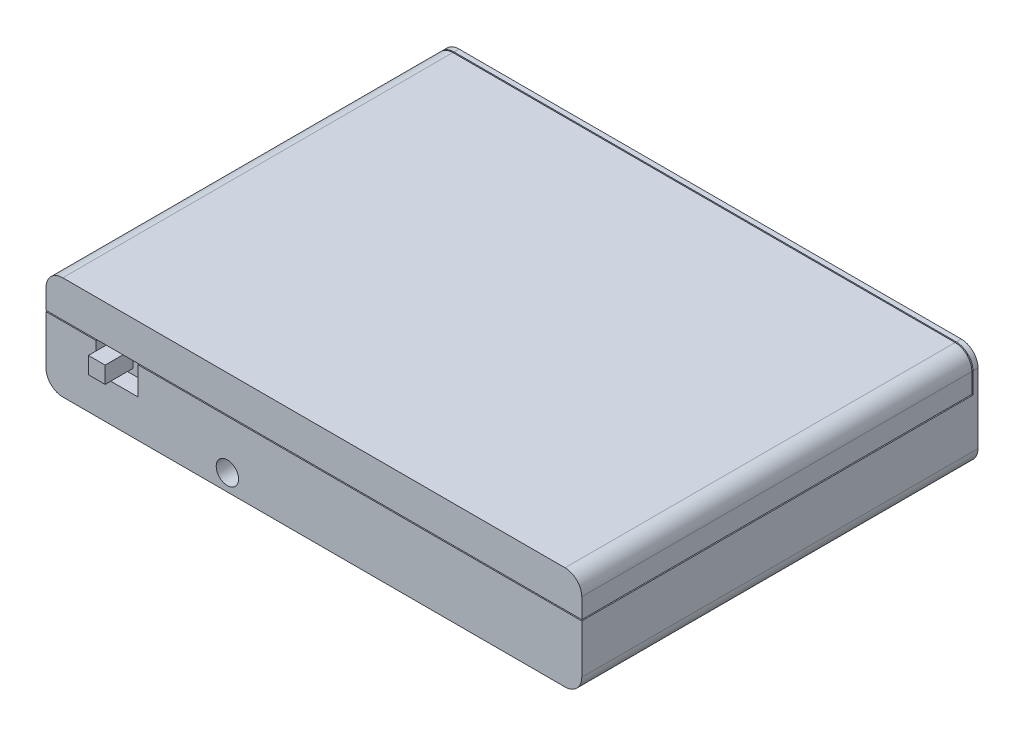
ISO-10303-21;
HEADER;
FILE_DESCRIPTION(('STEP AP214'),'2;1');
FILE_NAME('part.step','',(''),(''),'','','');
FILE_SCHEMA(('AUTOMOTIVE_DESIGN { 1 0 10303 214 1 1 1 1 }'));
ENDSEC;
DATA;
#1=APPLICATION_CONTEXT('core data for automotive mechanical design processes');
#2=APPLICATION_PROTOCOL_DEFINITION('international standard','automotive_design',2000,#1);
#3=PRODUCT_CONTEXT('',#1,'mechanical');
#4=PRODUCT('Part','Part','',(#3));
#5=PRODUCT_RELATED_PRODUCT_CATEGORY('part','',(#4));
#6=PRODUCT_DEFINITION_FORMATION('','',#4);
#7=PRODUCT_DEFINITION_CONTEXT('part definition',#1,'design');
#8=PRODUCT_DEFINITION('design','',#6,#7);
#9=PRODUCT_DEFINITION_SHAPE('','',#8);
#10=(LENGTH_UNIT() NAMED_UNIT(*) SI_UNIT(.MILLI.,.METRE.));
#11=(NAMED_UNIT(*) PLANE_ANGLE_UNIT() SI_UNIT($,.RADIAN.));
#12=(NAMED_UNIT(*) SI_UNIT($,.STERADIAN.) SOLID_ANGLE_UNIT());
#13=UNCERTAINTY_MEASURE_WITH_UNIT(LENGTH_MEASURE(1.E-05),#10,'distance_accuracy_value','');
#14=(GEOMETRIC_REPRESENTATION_CONTEXT(3) GLOBAL_UNCERTAINTY_ASSIGNED_CONTEXT((#13)) GLOBAL_UNIT_ASSIGNED_CONTEXT((#10,
#11,#12)) REPRESENTATION_CONTEXT('',''));
#15=CARTESIAN_POINT('',(0.,0.,0.));
#16=DIRECTION('',(0.,0.,1.));
#17=DIRECTION('',(1.,0.,0.));
#18=AXIS2_PLACEMENT_3D('',#15,#16,#17);
#19=CARTESIAN_POINT('',(48.,-9.25,-35.5));
#20=DIRECTION('',(1.,0.,0.));
#21=DIRECTION('',(0.,0.,-1.));
#22=AXIS2_PLACEMENT_3D('',#19,#20,#21);
#23=PLANE('',#22);
#24=DIRECTION('',(0.,1.,0.));
#25=VECTOR('',#24,1.);
#26=CARTESIAN_POINT('',(48.,8.25,-34.4));
#27=LINE('',#26,#25);
#28=CARTESIAN_POINT('',(48.,2.7,-34.4));
#29=VERTEX_POINT('',#28);
#30=CARTESIAN_POINT('',(48.,6.25,-34.4));
#31=VERTEX_POINT('',#30);
#32=EDGE_CURVE('E301',#29,#31,#27,.T.);
#33=ORIENTED_EDGE('',*,*,#32,.T.);
#34=DIRECTION('',(0.,0.,-1.));
#35=VECTOR('',#34,1.);
#36=CARTESIAN_POINT('',(48.,6.25,-35.5));
#37=LINE('',#36,#35);
#38=CARTESIAN_POINT('',(48.,6.25,35.5));
#39=VERTEX_POINT('',#38);
#40=EDGE_CURVE('E11',#31,#39,#37,.F.);
#41=ORIENTED_EDGE('',*,*,#40,.T.);
#42=DIRECTION('',(0.,1.,0.));
#43=VECTOR('',#42,1.);
#44=CARTESIAN_POINT('',(48.,-9.25,35.5));
#45=LINE('',#44,#43);
#46=CARTESIAN_POINT('',(48.,2.7,35.5));
#47=VERTEX_POINT('',#46);
#48=EDGE_CURVE('E413',#47,#39,#45,.T.);
#49=ORIENTED_EDGE('',*,*,#48,.F.);
#50=DIRECTION('',(0.,0.,1.));
#51=VECTOR('',#50,1.);
#52=CARTESIAN_POINT('',(48.,2.7,34.5));
#53=LINE('',#52,#51);
#54=EDGE_CURVE('E325',#29,#47,#53,.T.);
#55=ORIENTED_EDGE('',*,*,#54,.F.);
#56=EDGE_LOOP('',(#33,#41,#49,#55));
#57=FACE_BOUND('',#56,.T.);
#58=ADVANCED_FACE('F33',(#57),#23,.T.);
#59=CARTESIAN_POINT('',(0.,8.25,0.));
#60=DIRECTION('',(0.,1.,0.));
#61=DIRECTION('',(0.,0.,1.));
#62=AXIS2_PLACEMENT_3D('',#59,#60,#61);
#63=PLANE('',#62);
#64=DIRECTION('',(1.,0.,0.));
#65=VECTOR('',#64,1.);
#66=CARTESIAN_POINT('',(48.,8.25,-34.4));
#67=LINE('',#66,#65);
#68=CARTESIAN_POINT('',(-47.,8.25,-34.4));
#69=VERTEX_POINT('',#68);
#70=CARTESIAN_POINT('',(47.,8.25,-34.4));
#71=VERTEX_POINT('',#70);
#72=EDGE_CURVE('E289',#69,#71,#67,.T.);
#73=ORIENTED_EDGE('',*,*,#72,.T.);
#74=DIRECTION('',(0.,0.,1.));
#75=VECTOR('',#74,1.);
#76=CARTESIAN_POINT('',(47.,8.25,-34.4));
#77=LINE('',#76,#75);
#78=CARTESIAN_POINT('',(47.,8.25,-34.6));
#79=VERTEX_POINT('',#78);
#80=EDGE_CURVE('E260',#79,#71,#77,.T.);
#81=ORIENTED_EDGE('',*,*,#80,.F.);
#82=DIRECTION('',(-1.,0.,0.));
#83=VECTOR('',#82,1.);
#84=CARTESIAN_POINT('',(48.,8.25,-34.6));
#85=LINE('',#84,#83);
#86=CARTESIAN_POINT('',(-47.,8.25,-34.6));
#87=VERTEX_POINT('',#86);
#88=EDGE_CURVE('E266',#79,#87,#85,.T.);
#89=ORIENTED_EDGE('',*,*,#88,.T.);
#90=DIRECTION('',(0.,0.,-1.));
#91=VECTOR('',#90,1.);
#92=CARTESIAN_POINT('',(-47.,8.25,-34.4));
#93=LINE('',#92,#91);
#94=EDGE_CURVE('E276',#69,#87,#93,.T.);
#95=ORIENTED_EDGE('',*,*,#94,.F.);
#96=EDGE_LOOP('',(#73,#81,#89,#95));
#97=FACE_BOUND('',#96,.T.);
#98=ADVANCED_FACE('F508',(#97),#63,.T.);
#99=CARTESIAN_POINT('',(-48.,-9.25,-35.5));
#100=DIRECTION('',(-1.,0.,0.));
#101=DIRECTION('',(0.,0.,1.));
#102=AXIS2_PLACEMENT_3D('',#99,#100,#101);
#103=PLANE('',#102);
#104=DIRECTION('',(0.,1.,0.));
#105=VECTOR('',#104,1.);
#106=CARTESIAN_POINT('',(-48.,-9.25,35.5));
#107=LINE('',#106,#105);
#108=CARTESIAN_POINT('',(-48.,2.7,35.5));
#109=VERTEX_POINT('',#108);
#110=CARTESIAN_POINT('',(-48.,6.25,35.5));
#111=VERTEX_POINT('',#110);
#112=EDGE_CURVE('E416',#109,#111,#107,.T.);
#113=ORIENTED_EDGE('',*,*,#112,.T.);
#114=DIRECTION('',(0.,0.,1.));
#115=VECTOR('',#114,1.);
#116=CARTESIAN_POINT('',(-48.,6.25,-35.5));
#117=LINE('',#116,#115);
#118=CARTESIAN_POINT('',(-48.,6.25,-34.4));
#119=VERTEX_POINT('',#118);
#120=EDGE_CURVE('E56',#111,#119,#117,.F.);
#121=ORIENTED_EDGE('',*,*,#120,.T.);
#122=DIRECTION('',(0.,1.,0.));
#123=VECTOR('',#122,1.);
#124=CARTESIAN_POINT('',(-48.,8.25,-34.4));
#125=LINE('',#124,#123);
#126=CARTESIAN_POINT('',(-48.,2.7,-34.4));
#127=VERTEX_POINT('',#126);
#128=EDGE_CURVE('E294',#127,#119,#125,.T.);
#129=ORIENTED_EDGE('',*,*,#128,.F.);
#130=DIRECTION('',(0.,0.,1.));
#131=VECTOR('',#130,1.);
#132=CARTESIAN_POINT('',(-48.,2.7,34.5));
#133=LINE('',#132,#131);
#134=EDGE_CURVE('E322',#127,#109,#133,.T.);
#135=ORIENTED_EDGE('',*,*,#134,.T.);
#136=EDGE_LOOP('',(#113,#121,#129,#135));
#137=FACE_BOUND('',#136,.T.);
#138=ADVANCED_FACE('F490',(#137),#103,.T.);
#139=CARTESIAN_POINT('',(0.,9.25,0.));
#140=DIRECTION('',(0.,1.,0.));
#141=DIRECTION('',(0.,0.,1.));
#142=AXIS2_PLACEMENT_3D('',#139,#140,#141);
#143=PLANE('',#142);
#144=DIRECTION('',(-1.,0.,0.));
#145=VECTOR('',#144,1.);
#146=CARTESIAN_POINT('',(-48.,9.25,-35.5));
#147=LINE('',#146,#145);
#148=CARTESIAN_POINT('',(45.,9.25,-35.5));
#149=VERTEX_POINT('',#148);
#150=CARTESIAN_POINT('',(-45.,9.25,-35.5));
#151=VERTEX_POINT('',#150);
#152=EDGE_CURVE('E388',#149,#151,#147,.T.);
#153=ORIENTED_EDGE('',*,*,#152,.T.);
#154=DIRECTION('',(0.,0.,1.));
#155=VECTOR('',#154,1.);
#156=CARTESIAN_POINT('',(-45.,9.25,0.));
#157=LINE('',#156,#155);
#158=CARTESIAN_POINT('',(-45.,9.25,-34.6));
#159=VERTEX_POINT('',#158);
#160=EDGE_CURVE('E449',#151,#159,#157,.T.);
#161=ORIENTED_EDGE('',*,*,#160,.T.);
#162=DIRECTION('',(-1.,0.,0.));
#163=VECTOR('',#162,1.);
#164=CARTESIAN_POINT('',(48.,9.25,-34.6));
#165=LINE('',#164,#163);
#166=CARTESIAN_POINT('',(45.,9.25,-34.6));
#167=VERTEX_POINT('',#166);
#168=EDGE_CURVE('E292',#167,#159,#165,.T.);
#169=ORIENTED_EDGE('',*,*,#168,.F.);
#170=DIRECTION('',(0.,0.,-1.));
#171=VECTOR('',#170,1.);
#172=CARTESIAN_POINT('',(45.,9.25,0.));
#173=LINE('',#172,#171);
#174=EDGE_CURVE('E446',#167,#149,#173,.T.);
#175=ORIENTED_EDGE('',*,*,#174,.T.);
#176=EDGE_LOOP('',(#153,#161,#169,#175));
#177=FACE_BOUND('',#176,.T.);
#178=ADVANCED_FACE('F541',(#177),#143,.T.);
#179=CARTESIAN_POINT('',(0.,0.,34.5));
#180=DIRECTION('',(0.,0.,-1.));
#181=DIRECTION('',(-1.,0.,0.));
#182=AXIS2_PLACEMENT_3D('',#179,#180,#181);
#183=PLANE('',#182);
#184=DIRECTION('',(0.,-1.,0.));
#185=VECTOR('',#184,1.);
#186=CARTESIAN_POINT('',(47.,0.,34.5));
#187=LINE('',#186,#185);
#188=CARTESIAN_POINT('',(47.,2.7,34.5));
#189=VERTEX_POINT('',#188);
#190=CARTESIAN_POINT('',(47.,2.5,34.5));
#191=VERTEX_POINT('',#190);
#192=EDGE_CURVE('E244',#189,#191,#187,.T.);
#193=ORIENTED_EDGE('',*,*,#192,.F.);
#194=DIRECTION('',(-1.,0.,0.));
#195=VECTOR('',#194,1.);
#196=CARTESIAN_POINT('',(-48.,2.7,34.5));
#197=LINE('',#196,#195);
#198=CARTESIAN_POINT('',(-47.,2.7,34.5));
#199=VERTEX_POINT('',#198);
#200=EDGE_CURVE('E313',#189,#199,#197,.T.);
#201=ORIENTED_EDGE('',*,*,#200,.T.);
#202=DIRECTION('',(0.,-1.,0.));
#203=VECTOR('',#202,1.);
#204=CARTESIAN_POINT('',(-47.,0.,34.5));
#205=LINE('',#204,#203);
#206=CARTESIAN_POINT('',(-47.,2.5,34.5));
#207=VERTEX_POINT('',#206);
#208=EDGE_CURVE('E424',#199,#207,#205,.T.);
#209=ORIENTED_EDGE('',*,*,#208,.T.);
#210=DIRECTION('',(1.,0.,0.));
#211=VECTOR('',#210,1.);
#212=CARTESIAN_POINT('',(-48.,2.5,34.5));
#213=LINE('',#212,#211);
#214=CARTESIAN_POINT('',(-39.,2.49999999999999,34.5));
#215=VERTEX_POINT('',#214);
#216=EDGE_CURVE('E311',#207,#215,#213,.T.);
#217=ORIENTED_EDGE('',*,*,#216,.T.);
#218=DIRECTION('',(-1.,0.,0.));
#219=VECTOR('',#218,1.);
#220=CARTESIAN_POINT('',(-39.,2.49999999999999,34.5));
#221=LINE('',#220,#219);
#222=CARTESIAN_POINT('',(-31.5,2.5,34.5));
#223=VERTEX_POINT('',#222);
#224=EDGE_CURVE('E412',#223,#215,#221,.T.);
#225=ORIENTED_EDGE('',*,*,#224,.F.);
#226=EDGE_CURVE('E314',#223,#191,#213,.T.);
#227=ORIENTED_EDGE('',*,*,#226,.T.);
#228=EDGE_LOOP('',(#193,#201,#209,#217,#225,#227));
#229=FACE_BOUND('',#228,.T.);
#230=ADVANCED_FACE('F572',(#229),#183,.F.);
#231=CARTESIAN_POINT('',(-48.,-9.25,35.5));
#232=DIRECTION('',(0.,0.,1.));
#233=DIRECTION('',(1.,0.,0.));
#234=AXIS2_PLACEMENT_3D('',#231,#232,#233);
#235=PLANE('',#234);
#236=DIRECTION('',(1.,0.,0.));
#237=VECTOR('',#236,1.);
#238=CARTESIAN_POINT('',(-48.,9.25,35.5));
#239=LINE('',#238,#237);
#240=CARTESIAN_POINT('',(-45.,9.25,35.5));
#241=VERTEX_POINT('',#240);
#242=CARTESIAN_POINT('',(45.,9.25,35.5));
#243=VERTEX_POINT('',#242);
#244=EDGE_CURVE('E400',#241,#243,#239,.T.);
#245=ORIENTED_EDGE('',*,*,#244,.F.);
#246=CARTESIAN_POINT('',(-45.,6.25,35.5));
#247=DIRECTION('',(0.,0.,1.));
#248=DIRECTION('',(1.,0.,0.));
#249=AXIS2_PLACEMENT_3D('',#246,#247,#248);
#250=CIRCLE('',#249,3.);
#251=EDGE_CURVE('E472',#241,#111,#250,.T.);
#252=ORIENTED_EDGE('',*,*,#251,.T.);
#253=ORIENTED_EDGE('',*,*,#112,.F.);
#254=DIRECTION('',(-1.,0.,0.));
#255=VECTOR('',#254,1.);
#256=CARTESIAN_POINT('',(-48.,2.7,35.5));
#257=LINE('',#256,#255);
#258=EDGE_CURVE('E319',#47,#109,#257,.T.);
#259=ORIENTED_EDGE('',*,*,#258,.F.);
#260=ORIENTED_EDGE('',*,*,#48,.T.);
#261=CARTESIAN_POINT('',(45.,6.25,35.5));
#262=DIRECTION('',(0.,0.,1.));
#263=DIRECTION('',(1.,0.,0.));
#264=AXIS2_PLACEMENT_3D('',#261,#262,#263);
#265=CIRCLE('',#264,3.);
#266=EDGE_CURVE('E470',#39,#243,#265,.T.);
#267=ORIENTED_EDGE('',*,*,#266,.T.);
#268=EDGE_LOOP('',(#245,#252,#253,#259,#260,#267));
#269=FACE_BOUND('',#268,.T.);
#270=ADVANCED_FACE('F488',(#269),#235,.T.);
#271=CARTESIAN_POINT('',(0.,0.,32.5));
#272=DIRECTION('',(0.,0.,1.));
#273=DIRECTION('',(1.,0.,0.));
#274=AXIS2_PLACEMENT_3D('',#271,#272,#273);
#275=PLANE('',#274);
#276=DIRECTION('',(0.,1.,0.));
#277=VECTOR('',#276,1.);
#278=CARTESIAN_POINT('',(-31.5,2.5,32.5));
#279=LINE('',#278,#277);
#280=CARTESIAN_POINT('',(-31.5,-2.5,32.5));
#281=VERTEX_POINT('',#280);
#282=CARTESIAN_POINT('',(-31.5,2.5,32.5));
#283=VERTEX_POINT('',#282);
#284=EDGE_CURVE('E365',#281,#283,#279,.T.);
#285=ORIENTED_EDGE('',*,*,#284,.T.);
#286=DIRECTION('',(-1.,0.,0.));
#287=VECTOR('',#286,1.);
#288=CARTESIAN_POINT('',(-39.,2.49999999999999,32.5));
#289=LINE('',#288,#287);
#290=CARTESIAN_POINT('',(-39.,2.49999999999999,32.5));
#291=VERTEX_POINT('',#290);
#292=EDGE_CURVE('E368',#283,#291,#289,.T.);
#293=ORIENTED_EDGE('',*,*,#292,.T.);
#294=DIRECTION('',(0.,-1.,0.));
#295=VECTOR('',#294,1.);
#296=CARTESIAN_POINT('',(-39.,2.49999999999999,32.5));
#297=LINE('',#296,#295);
#298=CARTESIAN_POINT('',(-39.,-2.49999999999999,32.5));
#299=VERTEX_POINT('',#298);
#300=EDGE_CURVE('E372',#291,#299,#297,.T.);
#301=ORIENTED_EDGE('',*,*,#300,.T.);
#302=DIRECTION('',(1.,0.,0.));
#303=VECTOR('',#302,1.);
#304=CARTESIAN_POINT('',(-39.,-2.49999999999999,32.5));
#305=LINE('',#304,#303);
#306=EDGE_CURVE('E375',#299,#281,#305,.T.);
#307=ORIENTED_EDGE('',*,*,#306,.T.);
#308=EDGE_LOOP('',(#285,#293,#301,#307));
#309=FACE_BOUND('',#308,.T.);
#310=DIRECTION('',(-1.,0.,0.));
#311=VECTOR('',#310,1.);
#312=CARTESIAN_POINT('',(-38.4046429697471,1.50000000000001,32.5));
#313=LINE('',#312,#311);
#314=CARTESIAN_POINT('',(-35.4046429697471,1.50000000000001,32.5));
#315=VERTEX_POINT('',#314);
#316=CARTESIAN_POINT('',(-38.4046429697471,1.50000000000001,32.5));
#317=VERTEX_POINT('',#316);
#318=EDGE_CURVE('E349',#315,#317,#313,.T.);
#319=ORIENTED_EDGE('',*,*,#318,.F.);
#320=DIRECTION('',(0.,1.,0.));
#321=VECTOR('',#320,1.);
#322=CARTESIAN_POINT('',(-35.4046429697471,-1.49999999999999,32.5));
#323=LINE('',#322,#321);
#324=CARTESIAN_POINT('',(-35.4046429697471,-1.49999999999999,32.5));
#325=VERTEX_POINT('',#324);
#326=EDGE_CURVE('E333',#325,#315,#323,.T.);
#327=ORIENTED_EDGE('',*,*,#326,.F.);
#328=DIRECTION('',(1.,0.,0.));
#329=VECTOR('',#328,1.);
#330=CARTESIAN_POINT('',(-38.4046429697471,-1.49999999999999,32.5));
#331=LINE('',#330,#329);
#332=CARTESIAN_POINT('',(-38.4046429697471,-1.49999999999999,32.5));
#333=VERTEX_POINT('',#332);
#334=EDGE_CURVE('E340',#333,#325,#331,.T.);
#335=ORIENTED_EDGE('',*,*,#334,.F.);
#336=DIRECTION('',(0.,-1.,0.));
#337=VECTOR('',#336,1.);
#338=CARTESIAN_POINT('',(-38.4046429697471,-1.49999999999999,32.5));
#339=LINE('',#338,#337);
#340=EDGE_CURVE('E351',#317,#333,#339,.T.);
#341=ORIENTED_EDGE('',*,*,#340,.F.);
#342=EDGE_LOOP('',(#319,#327,#335,#341));
#343=FACE_BOUND('',#342,.T.);
#344=ADVANCED_FACE('F520',(#309,#343),#275,.T.);
#345=DIRECTION('',(0.,1.,0.));
#346=VECTOR('',#345,1.);
#347=CARTESIAN_POINT('',(48.,-9.25,-35.5));
#348=LINE('',#347,#346);
#349=CARTESIAN_POINT('',(48.,-6.25,-35.5));
#350=VERTEX_POINT('',#349);
#351=CARTESIAN_POINT('',(48.,6.25,-35.5));
#352=VERTEX_POINT('',#351);
#353=EDGE_CURVE('E409',#350,#352,#348,.T.);
#354=ORIENTED_EDGE('',*,*,#353,.T.);
#355=DIRECTION('',(0.,0.,-1.));
#356=VECTOR('',#355,1.);
#357=CARTESIAN_POINT('',(48.,6.25,-35.5));
#358=LINE('',#357,#356);
#359=CARTESIAN_POINT('',(48.,6.25,-34.6));
#360=VERTEX_POINT('',#359);
#361=EDGE_CURVE('E462',#352,#360,#358,.F.);
#362=ORIENTED_EDGE('',*,*,#361,.T.);
#363=DIRECTION('',(0.,1.,0.));
#364=VECTOR('',#363,1.);
#365=CARTESIAN_POINT('',(48.,8.25,-34.6));
#366=LINE('',#365,#364);
#367=CARTESIAN_POINT('',(48.,2.5,-34.6));
#368=VERTEX_POINT('',#367);
#369=EDGE_CURVE('E299',#368,#360,#366,.T.);
#370=ORIENTED_EDGE('',*,*,#369,.F.);
#371=DIRECTION('',(0.,0.,1.));
#372=VECTOR('',#371,1.);
#373=CARTESIAN_POINT('',(48.,2.5,34.5));
#374=LINE('',#373,#372);
#375=CARTESIAN_POINT('',(48.,2.5,35.5));
#376=VERTEX_POINT('',#375);
#377=EDGE_CURVE('E255',#368,#376,#374,.T.);
#378=ORIENTED_EDGE('',*,*,#377,.T.);
#379=CARTESIAN_POINT('',(48.,-6.25,35.5));
#380=VERTEX_POINT('',#379);
#381=EDGE_CURVE('E410',#380,#376,#45,.T.);
#382=ORIENTED_EDGE('',*,*,#381,.F.);
#383=DIRECTION('',(0.,0.,-1.));
#384=VECTOR('',#383,1.);
#385=CARTESIAN_POINT('',(48.,-6.25,-35.5));
#386=LINE('',#385,#384);
#387=EDGE_CURVE('E428',#380,#350,#386,.T.);
#388=ORIENTED_EDGE('',*,*,#387,.T.);
#389=EDGE_LOOP('',(#354,#362,#370,#378,#382,#388));
#390=FACE_BOUND('',#389,.T.);
#391=ADVANCED_FACE('F510',(#390),#23,.T.);
#392=DIRECTION('',(1.,0.,0.));
#393=VECTOR('',#392,1.);
#394=CARTESIAN_POINT('',(-48.,-9.25,35.5));
#395=LINE('',#394,#393);
#396=CARTESIAN_POINT('',(-45.,-9.25,35.5));
#397=VERTEX_POINT('',#396);
#398=CARTESIAN_POINT('',(45.,-9.25,35.5));
#399=VERTEX_POINT('',#398);
#400=EDGE_CURVE('E406',#397,#399,#395,.T.);
#401=ORIENTED_EDGE('',*,*,#400,.T.);
#402=CARTESIAN_POINT('',(45.,-6.25,35.5));
#403=DIRECTION('',(0.,0.,1.));
#404=DIRECTION('',(1.,0.,0.));
#405=AXIS2_PLACEMENT_3D('',#402,#403,#404);
#406=CIRCLE('',#405,3.);
#407=EDGE_CURVE('E441',#399,#380,#406,.T.);
#408=ORIENTED_EDGE('',*,*,#407,.T.);
#409=ORIENTED_EDGE('',*,*,#381,.T.);
#410=DIRECTION('',(1.,0.,0.));
#411=VECTOR('',#410,1.);
#412=CARTESIAN_POINT('',(-48.,2.5,35.5));
#413=LINE('',#412,#411);
#414=CARTESIAN_POINT('',(-31.5,2.5,35.5));
#415=VERTEX_POINT('',#414);
#416=EDGE_CURVE('E310',#415,#376,#413,.T.);
#417=ORIENTED_EDGE('',*,*,#416,.F.);
#418=DIRECTION('',(0.,1.,0.));
#419=VECTOR('',#418,1.);
#420=CARTESIAN_POINT('',(-31.5,2.5,35.5));
#421=LINE('',#420,#419);
#422=CARTESIAN_POINT('',(-31.5,-2.5,35.5));
#423=VERTEX_POINT('',#422);
#424=EDGE_CURVE('E364',#423,#415,#421,.T.);
#425=ORIENTED_EDGE('',*,*,#424,.F.);
#426=DIRECTION('',(1.,0.,0.));
#427=VECTOR('',#426,1.);
#428=CARTESIAN_POINT('',(-39.,-2.49999999999999,35.5));
#429=LINE('',#428,#427);
#430=CARTESIAN_POINT('',(-39.,-2.49999999999999,35.5));
#431=VERTEX_POINT('',#430);
#432=EDGE_CURVE('E369',#431,#423,#429,.T.);
#433=ORIENTED_EDGE('',*,*,#432,.F.);
#434=DIRECTION('',(0.,-1.,0.));
#435=VECTOR('',#434,1.);
#436=CARTESIAN_POINT('',(-39.,2.49999999999999,35.5));
#437=LINE('',#436,#435);
#438=CARTESIAN_POINT('',(-39.,2.5,35.5));
#439=VERTEX_POINT('',#438);
#440=EDGE_CURVE('E381',#439,#431,#437,.T.);
#441=ORIENTED_EDGE('',*,*,#440,.F.);
#442=CARTESIAN_POINT('',(-48.,2.5,35.5));
#443=VERTEX_POINT('',#442);
#444=EDGE_CURVE('E317',#443,#439,#413,.T.);
#445=ORIENTED_EDGE('',*,*,#444,.F.);
#446=CARTESIAN_POINT('',(-48.,-6.25,35.5));
#447=VERTEX_POINT('',#446);
#448=EDGE_CURVE('E414',#447,#443,#107,.T.);
#449=ORIENTED_EDGE('',*,*,#448,.F.);
#450=CARTESIAN_POINT('',(-45.,-6.25,35.5));
#451=DIRECTION('',(0.,0.,1.));
#452=DIRECTION('',(1.,0.,0.));
#453=AXIS2_PLACEMENT_3D('',#450,#451,#452);
#454=CIRCLE('',#453,3.);
#455=EDGE_CURVE('E439',#447,#397,#454,.T.);
#456=ORIENTED_EDGE('',*,*,#455,.T.);
#457=EDGE_LOOP('',(#401,#408,#409,#417,#425,#433,#441,#445,#449,#456));
#458=FACE_BOUND('',#457,.T.);
#459=CARTESIAN_POINT('',(-15.5,-6.25,35.5));
#460=DIRECTION('',(0.,0.,1.));
#461=DIRECTION('',(1.,0.,0.));
#462=AXIS2_PLACEMENT_3D('',#459,#460,#461);
#463=CIRCLE('',#462,2.);
#464=CARTESIAN_POINT('',(-13.5,-6.25,35.5));
#465=VERTEX_POINT('',#464);
#466=EDGE_CURVE('E324',#465,#465,#463,.T.);
#467=ORIENTED_EDGE('',*,*,#466,.F.);
#468=EDGE_LOOP('',(#467));
#469=FACE_BOUND('',#468,.T.);
#470=ADVANCED_FACE('F519',(#458,#469),#235,.T.);
#471=DIRECTION('',(0.,1.,0.));
#472=VECTOR('',#471,1.);
#473=CARTESIAN_POINT('',(-48.,8.25,-34.6));
#474=LINE('',#473,#472);
#475=CARTESIAN_POINT('',(-48.,2.49999999999999,-34.6));
#476=VERTEX_POINT('',#475);
#477=CARTESIAN_POINT('',(-48.,6.25,-34.6));
#478=VERTEX_POINT('',#477);
#479=EDGE_CURVE('E248',#476,#478,#474,.T.);
#480=ORIENTED_EDGE('',*,*,#479,.T.);
#481=DIRECTION('',(0.,0.,1.));
#482=VECTOR('',#481,1.);
#483=CARTESIAN_POINT('',(-48.,6.25,-35.5));
#484=LINE('',#483,#482);
#485=CARTESIAN_POINT('',(-48.,6.25,-35.5));
#486=VERTEX_POINT('',#485);
#487=EDGE_CURVE('E456',#478,#486,#484,.F.);
#488=ORIENTED_EDGE('',*,*,#487,.T.);
#489=DIRECTION('',(0.,1.,0.));
#490=VECTOR('',#489,1.);
#491=CARTESIAN_POINT('',(-48.,-9.25,-35.5));
#492=LINE('',#491,#490);
#493=CARTESIAN_POINT('',(-48.,-6.25,-35.5));
#494=VERTEX_POINT('',#493);
#495=EDGE_CURVE('E417',#494,#486,#492,.T.);
#496=ORIENTED_EDGE('',*,*,#495,.F.);
#497=DIRECTION('',(0.,0.,1.));
#498=VECTOR('',#497,1.);
#499=CARTESIAN_POINT('',(-48.,-6.25,35.5));
#500=LINE('',#499,#498);
#501=EDGE_CURVE('E443',#494,#447,#500,.T.);
#502=ORIENTED_EDGE('',*,*,#501,.T.);
#503=ORIENTED_EDGE('',*,*,#448,.T.);
#504=DIRECTION('',(0.,0.,1.));
#505=VECTOR('',#504,1.);
#506=CARTESIAN_POINT('',(-48.,2.5,34.5));
#507=LINE('',#506,#505);
#508=EDGE_CURVE('E316',#476,#443,#507,.T.);
#509=ORIENTED_EDGE('',*,*,#508,.F.);
#510=EDGE_LOOP('',(#480,#488,#496,#502,#503,#509));
#511=FACE_BOUND('',#510,.T.);
#512=ADVANCED_FACE('F526',(#511),#103,.T.);
#513=CARTESIAN_POINT('',(-48.,-9.25,-35.5));
#514=DIRECTION('',(0.,0.,-1.));
#515=DIRECTION('',(-1.,0.,0.));
#516=AXIS2_PLACEMENT_3D('',#513,#514,#515);
#517=PLANE('',#516);
#518=ORIENTED_EDGE('',*,*,#495,.T.);
#519=CARTESIAN_POINT('',(-45.,6.25,-35.5));
#520=DIRECTION('',(0.,0.,-1.));
#521=DIRECTION('',(-1.,0.,0.));
#522=AXIS2_PLACEMENT_3D('',#519,#520,#521);
#523=CIRCLE('',#522,3.);
#524=EDGE_CURVE('E460',#486,#151,#523,.T.);
#525=ORIENTED_EDGE('',*,*,#524,.T.);
#526=ORIENTED_EDGE('',*,*,#152,.F.);
#527=CARTESIAN_POINT('',(45.,6.25,-35.5));
#528=DIRECTION('',(0.,0.,-1.));
#529=DIRECTION('',(-1.,0.,0.));
#530=AXIS2_PLACEMENT_3D('',#527,#528,#529);
#531=CIRCLE('',#530,3.);
#532=EDGE_CURVE('E458',#149,#352,#531,.T.);
#533=ORIENTED_EDGE('',*,*,#532,.T.);
#534=ORIENTED_EDGE('',*,*,#353,.F.);
#535=CARTESIAN_POINT('',(45.,-6.25,-35.5));
#536=DIRECTION('',(0.,0.,-1.));
#537=DIRECTION('',(-1.,0.,0.));
#538=AXIS2_PLACEMENT_3D('',#535,#536,#537);
#539=CIRCLE('',#538,3.);
#540=CARTESIAN_POINT('',(45.,-9.25,-35.5));
#541=VERTEX_POINT('',#540);
#542=EDGE_CURVE('E433',#350,#541,#539,.T.);
#543=ORIENTED_EDGE('',*,*,#542,.T.);
#544=DIRECTION('',(-1.,0.,0.));
#545=VECTOR('',#544,1.);
#546=CARTESIAN_POINT('',(-48.,-9.25,-35.5));
#547=LINE('',#546,#545);
#548=CARTESIAN_POINT('',(-45.,-9.25,-35.5));
#549=VERTEX_POINT('',#548);
#550=EDGE_CURVE('E403',#541,#549,#547,.T.);
#551=ORIENTED_EDGE('',*,*,#550,.T.);
#552=CARTESIAN_POINT('',(-45.,-6.25,-35.5));
#553=DIRECTION('',(0.,0.,-1.));
#554=DIRECTION('',(-1.,0.,0.));
#555=AXIS2_PLACEMENT_3D('',#552,#553,#554);
#556=CIRCLE('',#555,3.);
#557=EDGE_CURVE('E431',#549,#494,#556,.T.);
#558=ORIENTED_EDGE('',*,*,#557,.T.);
#559=EDGE_LOOP('',(#518,#525,#526,#533,#534,#543,#551,#558));
#560=FACE_BOUND('',#559,.T.);
#561=ADVANCED_FACE('F582',(#560),#517,.T.);
#562=CARTESIAN_POINT('',(0.,-9.25,0.));
#563=DIRECTION('',(0.,1.,0.));
#564=DIRECTION('',(0.,0.,1.));
#565=AXIS2_PLACEMENT_3D('',#562,#563,#564);
#566=PLANE('',#565);
#567=ORIENTED_EDGE('',*,*,#550,.F.);
#568=DIRECTION('',(0.,0.,-1.));
#569=VECTOR('',#568,1.);
#570=CARTESIAN_POINT('',(45.,-9.25,35.5));
#571=LINE('',#570,#569);
#572=EDGE_CURVE('E437',#541,#399,#571,.F.);
#573=ORIENTED_EDGE('',*,*,#572,.T.);
#574=ORIENTED_EDGE('',*,*,#400,.F.);
#575=DIRECTION('',(0.,0.,1.));
#576=VECTOR('',#575,1.);
#577=CARTESIAN_POINT('',(-45.,-9.25,-35.5));
#578=LINE('',#577,#576);
#579=EDGE_CURVE('E435',#397,#549,#578,.F.);
#580=ORIENTED_EDGE('',*,*,#579,.T.);
#581=EDGE_LOOP('',(#567,#573,#574,#580));
#582=FACE_BOUND('',#581,.T.);
#583=ADVANCED_FACE('F585',(#582),#566,.F.);
#584=DIRECTION('',(1.,0.,0.));
#585=VECTOR('',#584,1.);
#586=CARTESIAN_POINT('',(48.,9.25,-34.4));
#587=LINE('',#586,#585);
#588=CARTESIAN_POINT('',(-45.,9.25,-34.4));
#589=VERTEX_POINT('',#588);
#590=CARTESIAN_POINT('',(45.,9.25,-34.4));
#591=VERTEX_POINT('',#590);
#592=EDGE_CURVE('E288',#589,#591,#587,.T.);
#593=ORIENTED_EDGE('',*,*,#592,.F.);
#594=DIRECTION('',(0.,0.,1.));
#595=VECTOR('',#594,1.);
#596=CARTESIAN_POINT('',(-45.,9.25,0.));
#597=LINE('',#596,#595);
#598=EDGE_CURVE('E467',#589,#241,#597,.T.);
#599=ORIENTED_EDGE('',*,*,#598,.T.);
#600=ORIENTED_EDGE('',*,*,#244,.T.);
#601=DIRECTION('',(0.,0.,-1.));
#602=VECTOR('',#601,1.);
#603=CARTESIAN_POINT('',(45.,9.25,0.));
#604=LINE('',#603,#602);
#605=EDGE_CURVE('E464',#243,#591,#604,.T.);
#606=ORIENTED_EDGE('',*,*,#605,.T.);
#607=EDGE_LOOP('',(#593,#599,#600,#606));
#608=FACE_BOUND('',#607,.T.);
#609=ADVANCED_FACE('F482',(#608),#143,.T.);
#610=CARTESIAN_POINT('',(-31.5,2.5,32.5));
#611=DIRECTION('',(1.,0.,0.));
#612=DIRECTION('',(0.,0.,-1.));
#613=AXIS2_PLACEMENT_3D('',#610,#611,#612);
#614=PLANE('',#613);
#615=ORIENTED_EDGE('',*,*,#424,.T.);
#616=DIRECTION('',(0.,0.,1.));
#617=VECTOR('',#616,1.);
#618=CARTESIAN_POINT('',(-31.5,2.5,32.5));
#619=LINE('',#618,#617);
#620=EDGE_CURVE('E378',#223,#415,#619,.T.);
#621=ORIENTED_EDGE('',*,*,#620,.F.);
#622=EDGE_CURVE('E395',#283,#223,#619,.T.);
#623=ORIENTED_EDGE('',*,*,#622,.F.);
#624=ORIENTED_EDGE('',*,*,#284,.F.);
#625=DIRECTION('',(0.,0.,1.));
#626=VECTOR('',#625,1.);
#627=CARTESIAN_POINT('',(-31.5,-2.5,32.5));
#628=LINE('',#627,#626);
#629=EDGE_CURVE('E386',#281,#423,#628,.T.);
#630=ORIENTED_EDGE('',*,*,#629,.T.);
#631=EDGE_LOOP('',(#615,#621,#623,#624,#630));
#632=FACE_BOUND('',#631,.T.);
#633=ADVANCED_FACE('F574',(#632),#614,.F.);
#634=CARTESIAN_POINT('',(-39.,-2.49999999999999,32.5));
#635=DIRECTION('',(0.,-1.,0.));
#636=DIRECTION('',(1.,0.,0.));
#637=AXIS2_PLACEMENT_3D('',#634,#635,#636);
#638=PLANE('',#637);
#639=ORIENTED_EDGE('',*,*,#432,.T.);
#640=ORIENTED_EDGE('',*,*,#629,.F.);
#641=ORIENTED_EDGE('',*,*,#306,.F.);
#642=DIRECTION('',(0.,0.,1.));
#643=VECTOR('',#642,1.);
#644=CARTESIAN_POINT('',(-39.,-2.49999999999999,32.5));
#645=LINE('',#644,#643);
#646=EDGE_CURVE('E389',#299,#431,#645,.T.);
#647=ORIENTED_EDGE('',*,*,#646,.T.);
#648=EDGE_LOOP('',(#639,#640,#641,#647));
#649=FACE_BOUND('',#648,.T.);
#650=ADVANCED_FACE('F740',(#649),#638,.F.);
#651=CARTESIAN_POINT('',(-39.,2.49999999999999,32.5));
#652=DIRECTION('',(-1.,0.,0.));
#653=DIRECTION('',(0.,0.,1.));
#654=AXIS2_PLACEMENT_3D('',#651,#652,#653);
#655=PLANE('',#654);
#656=ORIENTED_EDGE('',*,*,#440,.T.);
#657=ORIENTED_EDGE('',*,*,#646,.F.);
#658=ORIENTED_EDGE('',*,*,#300,.F.);
#659=DIRECTION('',(0.,0.,1.));
#660=VECTOR('',#659,1.);
#661=CARTESIAN_POINT('',(-39.,2.49999999999999,32.5));
#662=LINE('',#661,#660);
#663=EDGE_CURVE('E391',#291,#215,#662,.T.);
#664=ORIENTED_EDGE('',*,*,#663,.T.);
#665=EDGE_CURVE('E394',#215,#439,#662,.T.);
#666=ORIENTED_EDGE('',*,*,#665,.T.);
#667=EDGE_LOOP('',(#656,#657,#658,#664,#666));
#668=FACE_BOUND('',#667,.T.);
#669=ADVANCED_FACE('F564',(#668),#655,.F.);
#670=CARTESIAN_POINT('',(-39.,2.49999999999999,32.5));
#671=DIRECTION('',(0.,1.,0.));
#672=DIRECTION('',(-1.,0.,0.));
#673=AXIS2_PLACEMENT_3D('',#670,#671,#672);
#674=PLANE('',#673);
#675=ORIENTED_EDGE('',*,*,#622,.T.);
#676=ORIENTED_EDGE('',*,*,#224,.T.);
#677=ORIENTED_EDGE('',*,*,#663,.F.);
#678=ORIENTED_EDGE('',*,*,#292,.F.);
#679=EDGE_LOOP('',(#675,#676,#677,#678));
#680=FACE_BOUND('',#679,.T.);
#681=ADVANCED_FACE('F568',(#680),#674,.F.);
#682=CARTESIAN_POINT('',(-35.4046429697471,-1.49999999999999,37.5));
#683=DIRECTION('',(-1.,0.,0.));
#684=DIRECTION('',(0.,-1.,0.));
#685=AXIS2_PLACEMENT_3D('',#682,#683,#684);
#686=PLANE('',#685);
#687=ORIENTED_EDGE('',*,*,#326,.T.);
#688=DIRECTION('',(0.,0.,-1.));
#689=VECTOR('',#688,1.);
#690=CARTESIAN_POINT('',(-35.4046429697471,1.50000000000001,37.5));
#691=LINE('',#690,#689);
#692=CARTESIAN_POINT('',(-35.4046429697471,1.50000000000001,37.5));
#693=VERTEX_POINT('',#692);
#694=EDGE_CURVE('E362',#693,#315,#691,.T.);
#695=ORIENTED_EDGE('',*,*,#694,.F.);
#696=DIRECTION('',(0.,1.,0.));
#697=VECTOR('',#696,1.);
#698=CARTESIAN_POINT('',(-35.4046429697471,-1.49999999999999,37.5));
#699=LINE('',#698,#697);
#700=CARTESIAN_POINT('',(-35.4046429697471,-1.49999999999999,37.5));
#701=VERTEX_POINT('',#700);
#702=EDGE_CURVE('E336',#701,#693,#699,.T.);
#703=ORIENTED_EDGE('',*,*,#702,.F.);
#704=DIRECTION('',(0.,0.,-1.));
#705=VECTOR('',#704,1.);
#706=CARTESIAN_POINT('',(-35.4046429697471,-1.49999999999999,37.5));
#707=LINE('',#706,#705);
#708=EDGE_CURVE('E346',#701,#325,#707,.T.);
#709=ORIENTED_EDGE('',*,*,#708,.T.);
#710=EDGE_LOOP('',(#687,#695,#703,#709));
#711=FACE_BOUND('',#710,.T.);
#712=ADVANCED_FACE('F729',(#711),#686,.F.);
#713=CARTESIAN_POINT('',(-38.4046429697471,1.50000000000001,37.5));
#714=DIRECTION('',(0.,-1.,0.));
#715=DIRECTION('',(1.,0.,0.));
#716=AXIS2_PLACEMENT_3D('',#713,#714,#715);
#717=PLANE('',#716);
#718=ORIENTED_EDGE('',*,*,#318,.T.);
#719=DIRECTION('',(0.,0.,-1.));
#720=VECTOR('',#719,1.);
#721=CARTESIAN_POINT('',(-38.4046429697471,1.50000000000001,37.5));
#722=LINE('',#721,#720);
#723=CARTESIAN_POINT('',(-38.4046429697471,1.50000000000001,37.5));
#724=VERTEX_POINT('',#723);
#725=EDGE_CURVE('E359',#724,#317,#722,.T.);
#726=ORIENTED_EDGE('',*,*,#725,.F.);
#727=DIRECTION('',(-1.,0.,0.));
#728=VECTOR('',#727,1.);
#729=CARTESIAN_POINT('',(-38.4046429697471,1.50000000000001,37.5));
#730=LINE('',#729,#728);
#731=EDGE_CURVE('E339',#693,#724,#730,.T.);
#732=ORIENTED_EDGE('',*,*,#731,.F.);
#733=ORIENTED_EDGE('',*,*,#694,.T.);
#734=EDGE_LOOP('',(#718,#726,#732,#733));
#735=FACE_BOUND('',#734,.T.);
#736=ADVANCED_FACE('F802',(#735),#717,.F.);
#737=CARTESIAN_POINT('',(-38.4046429697471,-1.49999999999999,37.5));
#738=DIRECTION('',(1.,0.,0.));
#739=DIRECTION('',(0.,0.,-1.));
#740=AXIS2_PLACEMENT_3D('',#737,#738,#739);
#741=PLANE('',#740);
#742=ORIENTED_EDGE('',*,*,#340,.T.);
#743=DIRECTION('',(0.,0.,-1.));
#744=VECTOR('',#743,1.);
#745=CARTESIAN_POINT('',(-38.4046429697471,-1.49999999999999,37.5));
#746=LINE('',#745,#744);
#747=CARTESIAN_POINT('',(-38.4046429697471,-1.49999999999999,37.5));
#748=VERTEX_POINT('',#747);
#749=EDGE_CURVE('E357',#748,#333,#746,.T.);
#750=ORIENTED_EDGE('',*,*,#749,.F.);
#751=DIRECTION('',(0.,-1.,0.));
#752=VECTOR('',#751,1.);
#753=CARTESIAN_POINT('',(-38.4046429697471,-1.49999999999999,37.5));
#754=LINE('',#753,#752);
#755=EDGE_CURVE('E342',#724,#748,#754,.T.);
#756=ORIENTED_EDGE('',*,*,#755,.F.);
#757=ORIENTED_EDGE('',*,*,#725,.T.);
#758=EDGE_LOOP('',(#742,#750,#756,#757));
#759=FACE_BOUND('',#758,.T.);
#760=ADVANCED_FACE('F792',(#759),#741,.F.);
#761=CARTESIAN_POINT('',(-38.4046429697471,-1.49999999999999,37.5));
#762=DIRECTION('',(0.,1.,0.));
#763=DIRECTION('',(-1.,0.,0.));
#764=AXIS2_PLACEMENT_3D('',#761,#762,#763);
#765=PLANE('',#764);
#766=ORIENTED_EDGE('',*,*,#334,.T.);
#767=ORIENTED_EDGE('',*,*,#708,.F.);
#768=DIRECTION('',(1.,0.,0.));
#769=VECTOR('',#768,1.);
#770=CARTESIAN_POINT('',(-38.4046429697471,-1.49999999999999,37.5));
#771=LINE('',#770,#769);
#772=EDGE_CURVE('E344',#748,#701,#771,.T.);
#773=ORIENTED_EDGE('',*,*,#772,.F.);
#774=ORIENTED_EDGE('',*,*,#749,.T.);
#775=EDGE_LOOP('',(#766,#767,#773,#774));
#776=FACE_BOUND('',#775,.T.);
#777=ADVANCED_FACE('F782',(#776),#765,.F.);
#778=CARTESIAN_POINT('',(0.,0.,37.5));
#779=DIRECTION('',(0.,0.,-1.));
#780=DIRECTION('',(-1.,0.,0.));
#781=AXIS2_PLACEMENT_3D('',#778,#779,#780);
#782=PLANE('',#781);
#783=ORIENTED_EDGE('',*,*,#702,.T.);
#784=ORIENTED_EDGE('',*,*,#731,.T.);
#785=ORIENTED_EDGE('',*,*,#755,.T.);
#786=ORIENTED_EDGE('',*,*,#772,.T.);
#787=EDGE_LOOP('',(#783,#784,#785,#786));
#788=FACE_BOUND('',#787,.T.);
#789=ADVANCED_FACE('F772',(#788),#782,.F.);
#790=CARTESIAN_POINT('',(-15.5,-6.25,30.5));
#791=DIRECTION('',(0.,0.,1.));
#792=DIRECTION('',(1.,0.,0.));
#793=AXIS2_PLACEMENT_3D('',#790,#791,#792);
#794=CYLINDRICAL_SURFACE('',#793,2.);
#795=CARTESIAN_POINT('',(-15.5,-6.25,30.5));
#796=DIRECTION('',(0.,0.,1.));
#797=DIRECTION('',(1.,0.,0.));
#798=AXIS2_PLACEMENT_3D('',#795,#796,#797);
#799=CIRCLE('',#798,2.);
#800=CARTESIAN_POINT('',(-13.5,-6.25,30.5));
#801=VERTEX_POINT('',#800);
#802=EDGE_CURVE('E330',#801,#801,#799,.T.);
#803=ORIENTED_EDGE('',*,*,#802,.F.);
#804=EDGE_LOOP('',(#803));
#805=FACE_BOUND('',#804,.T.);
#806=ORIENTED_EDGE('',*,*,#466,.T.);
#807=EDGE_LOOP('',(#806));
#808=FACE_BOUND('',#807,.T.);
#809=ADVANCED_FACE('F761',(#805,#808),#794,.F.);
#810=CARTESIAN_POINT('',(-15.5,-6.25,30.5));
#811=DIRECTION('',(0.,0.,1.));
#812=DIRECTION('',(1.,0.,0.));
#813=AXIS2_PLACEMENT_3D('',#810,#811,#812);
#814=PLANE('',#813);
#815=ORIENTED_EDGE('',*,*,#802,.T.);
#816=EDGE_LOOP('',(#815));
#817=FACE_BOUND('',#816,.T.);
#818=ADVANCED_FACE('F679',(#817),#814,.T.);
#819=CARTESIAN_POINT('',(-48.,2.5,34.5));
#820=DIRECTION('',(0.,-1.,0.));
#821=DIRECTION('',(1.,0.,0.));
#822=AXIS2_PLACEMENT_3D('',#819,#820,#821);
#823=PLANE('',#822);
#824=ORIENTED_EDGE('',*,*,#416,.T.);
#825=ORIENTED_EDGE('',*,*,#377,.F.);
#826=DIRECTION('',(1.,0.,0.));
#827=VECTOR('',#826,1.);
#828=CARTESIAN_POINT('',(47.,2.5,-34.6));
#829=LINE('',#828,#827);
#830=CARTESIAN_POINT('',(47.,2.5,-34.6));
#831=VERTEX_POINT('',#830);
#832=EDGE_CURVE('E251',#831,#368,#829,.T.);
#833=ORIENTED_EDGE('',*,*,#832,.F.);
#834=DIRECTION('',(0.,0.,-1.));
#835=VECTOR('',#834,1.);
#836=CARTESIAN_POINT('',(47.,2.5,35.5));
#837=LINE('',#836,#835);
#838=EDGE_CURVE('E235',#191,#831,#837,.T.);
#839=ORIENTED_EDGE('',*,*,#838,.F.);
#840=ORIENTED_EDGE('',*,*,#226,.F.);
#841=ORIENTED_EDGE('',*,*,#620,.T.);
#842=EDGE_LOOP('',(#824,#825,#833,#839,#840,#841));
#843=FACE_BOUND('',#842,.T.);
#844=ADVANCED_FACE('F253',(#843),#823,.F.);
#845=ORIENTED_EDGE('',*,*,#216,.F.);
#846=DIRECTION('',(0.,0.,1.));
#847=VECTOR('',#846,1.);
#848=CARTESIAN_POINT('',(-47.,2.5,35.5));
#849=LINE('',#848,#847);
#850=CARTESIAN_POINT('',(-47.,2.49999999999999,-34.6));
#851=VERTEX_POINT('',#850);
#852=EDGE_CURVE('E308',#851,#207,#849,.T.);
#853=ORIENTED_EDGE('',*,*,#852,.F.);
#854=DIRECTION('',(-1.,0.,0.));
#855=VECTOR('',#854,1.);
#856=CARTESIAN_POINT('',(-47.,2.49999999999999,-34.6));
#857=LINE('',#856,#855);
#858=EDGE_CURVE('E282',#851,#476,#857,.T.);
#859=ORIENTED_EDGE('',*,*,#858,.T.);
#860=ORIENTED_EDGE('',*,*,#508,.T.);
#861=ORIENTED_EDGE('',*,*,#444,.T.);
#862=ORIENTED_EDGE('',*,*,#665,.F.);
#863=EDGE_LOOP('',(#845,#853,#859,#860,#861,#862));
#864=FACE_BOUND('',#863,.T.);
#865=ADVANCED_FACE('F556',(#864),#823,.F.);
#866=CARTESIAN_POINT('',(-48.,2.7,34.5));
#867=DIRECTION('',(0.,1.,0.));
#868=DIRECTION('',(-1.,0.,0.));
#869=AXIS2_PLACEMENT_3D('',#866,#867,#868);
#870=PLANE('',#869);
#871=DIRECTION('',(0.,0.,1.));
#872=VECTOR('',#871,1.);
#873=CARTESIAN_POINT('',(47.,2.7,35.5));
#874=LINE('',#873,#872);
#875=CARTESIAN_POINT('',(47.,2.7,-34.4));
#876=VERTEX_POINT('',#875);
#877=EDGE_CURVE('E247',#876,#189,#874,.T.);
#878=ORIENTED_EDGE('',*,*,#877,.F.);
#879=DIRECTION('',(1.,0.,0.));
#880=VECTOR('',#879,1.);
#881=CARTESIAN_POINT('',(-48.,2.7,-34.3999999999999));
#882=LINE('',#881,#880);
#883=EDGE_CURVE('E259',#876,#29,#882,.T.);
#884=ORIENTED_EDGE('',*,*,#883,.T.);
#885=ORIENTED_EDGE('',*,*,#54,.T.);
#886=ORIENTED_EDGE('',*,*,#258,.T.);
#887=ORIENTED_EDGE('',*,*,#134,.F.);
#888=DIRECTION('',(1.,0.,0.));
#889=VECTOR('',#888,1.);
#890=CARTESIAN_POINT('',(-48.,2.7,-34.4));
#891=LINE('',#890,#889);
#892=CARTESIAN_POINT('',(-47.,2.7,-34.4));
#893=VERTEX_POINT('',#892);
#894=EDGE_CURVE('E285',#127,#893,#891,.T.);
#895=ORIENTED_EDGE('',*,*,#894,.T.);
#896=DIRECTION('',(0.,0.,-1.));
#897=VECTOR('',#896,1.);
#898=CARTESIAN_POINT('',(-47.,2.7,35.5));
#899=LINE('',#898,#897);
#900=EDGE_CURVE('E305',#199,#893,#899,.T.);
#901=ORIENTED_EDGE('',*,*,#900,.F.);
#902=ORIENTED_EDGE('',*,*,#200,.F.);
#903=EDGE_LOOP('',(#878,#884,#885,#886,#887,#895,#901,#902));
#904=FACE_BOUND('',#903,.T.);
#905=ADVANCED_FACE('F494',(#904),#870,.F.);
#906=CARTESIAN_POINT('',(-47.,0.,0.));
#907=DIRECTION('',(1.,0.,0.));
#908=DIRECTION('',(0.,0.,-1.));
#909=AXIS2_PLACEMENT_3D('',#906,#907,#908);
#910=PLANE('',#909);
#911=ORIENTED_EDGE('',*,*,#900,.T.);
#912=DIRECTION('',(0.,1.,0.));
#913=VECTOR('',#912,1.);
#914=CARTESIAN_POINT('',(-47.,8.25,-34.4));
#915=LINE('',#914,#913);
#916=EDGE_CURVE('E274',#893,#69,#915,.T.);
#917=ORIENTED_EDGE('',*,*,#916,.T.);
#918=ORIENTED_EDGE('',*,*,#94,.T.);
#919=DIRECTION('',(0.,-1.,0.));
#920=VECTOR('',#919,1.);
#921=CARTESIAN_POINT('',(-47.,8.25,-34.6));
#922=LINE('',#921,#920);
#923=EDGE_CURVE('E279',#87,#851,#922,.T.);
#924=ORIENTED_EDGE('',*,*,#923,.T.);
#925=ORIENTED_EDGE('',*,*,#852,.T.);
#926=ORIENTED_EDGE('',*,*,#208,.F.);
#927=EDGE_LOOP('',(#911,#917,#918,#924,#925,#926));
#928=FACE_BOUND('',#927,.T.);
#929=ADVANCED_FACE('F664',(#928),#910,.F.);
#930=CARTESIAN_POINT('',(47.,0.,0.));
#931=DIRECTION('',(1.,0.,0.));
#932=DIRECTION('',(0.,0.,-1.));
#933=AXIS2_PLACEMENT_3D('',#930,#931,#932);
#934=PLANE('',#933);
#935=DIRECTION('',(0.,-1.,0.));
#936=VECTOR('',#935,1.);
#937=CARTESIAN_POINT('',(47.,8.25,-34.4));
#938=LINE('',#937,#936);
#939=EDGE_CURVE('E267',#71,#876,#938,.T.);
#940=ORIENTED_EDGE('',*,*,#939,.T.);
#941=ORIENTED_EDGE('',*,*,#877,.T.);
#942=ORIENTED_EDGE('',*,*,#192,.T.);
#943=ORIENTED_EDGE('',*,*,#838,.T.);
#944=DIRECTION('',(0.,1.,0.));
#945=VECTOR('',#944,1.);
#946=CARTESIAN_POINT('',(47.,8.25,-34.6));
#947=LINE('',#946,#945);
#948=EDGE_CURVE('E241',#831,#79,#947,.T.);
#949=ORIENTED_EDGE('',*,*,#948,.T.);
#950=ORIENTED_EDGE('',*,*,#80,.T.);
#951=EDGE_LOOP('',(#940,#941,#942,#943,#949,#950));
#952=FACE_BOUND('',#951,.T.);
#953=ADVANCED_FACE('F238',(#952),#934,.T.);
#954=CARTESIAN_POINT('',(48.,8.25,-34.6));
#955=DIRECTION('',(0.,0.,-1.));
#956=DIRECTION('',(-1.,0.,0.));
#957=AXIS2_PLACEMENT_3D('',#954,#955,#956);
#958=PLANE('',#957);
#959=ORIENTED_EDGE('',*,*,#168,.T.);
#960=CARTESIAN_POINT('',(-45.,6.25,-34.6));
#961=DIRECTION('',(0.,0.,-1.));
#962=DIRECTION('',(-1.,0.,0.));
#963=AXIS2_PLACEMENT_3D('',#960,#961,#962);
#964=CIRCLE('',#963,3.);
#965=EDGE_CURVE('E454',#159,#478,#964,.F.);
#966=ORIENTED_EDGE('',*,*,#965,.T.);
#967=ORIENTED_EDGE('',*,*,#479,.F.);
#968=ORIENTED_EDGE('',*,*,#858,.F.);
#969=ORIENTED_EDGE('',*,*,#923,.F.);
#970=ORIENTED_EDGE('',*,*,#88,.F.);
#971=ORIENTED_EDGE('',*,*,#948,.F.);
#972=ORIENTED_EDGE('',*,*,#832,.T.);
#973=ORIENTED_EDGE('',*,*,#369,.T.);
#974=CARTESIAN_POINT('',(45.,6.25,-34.6));
#975=DIRECTION('',(0.,0.,-1.));
#976=DIRECTION('',(-1.,0.,0.));
#977=AXIS2_PLACEMENT_3D('',#974,#975,#976);
#978=CIRCLE('',#977,3.);
#979=EDGE_CURVE('E452',#360,#167,#978,.F.);
#980=ORIENTED_EDGE('',*,*,#979,.T.);
#981=EDGE_LOOP('',(#959,#966,#967,#968,#969,#970,#971,#972,#973,#980));
#982=FACE_BOUND('',#981,.T.);
#983=ADVANCED_FACE('F264',(#982),#958,.F.);
#984=CARTESIAN_POINT('',(48.,8.25,-34.4));
#985=DIRECTION('',(0.,0.,1.));
#986=DIRECTION('',(1.,0.,0.));
#987=AXIS2_PLACEMENT_3D('',#984,#985,#986);
#988=PLANE('',#987);
#989=ORIENTED_EDGE('',*,*,#128,.T.);
#990=CARTESIAN_POINT('',(-45.,6.25,-34.4));
#991=DIRECTION('',(0.,0.,1.));
#992=DIRECTION('',(1.,0.,0.));
#993=AXIS2_PLACEMENT_3D('',#990,#991,#992);
#994=CIRCLE('',#993,3.);
#995=EDGE_CURVE('E41',#119,#589,#994,.F.);
#996=ORIENTED_EDGE('',*,*,#995,.T.);
#997=ORIENTED_EDGE('',*,*,#592,.T.);
#998=CARTESIAN_POINT('',(45.,6.25,-34.4));
#999=DIRECTION('',(0.,0.,1.));
#1000=DIRECTION('',(1.,0.,0.));
#1001=AXIS2_PLACEMENT_3D('',#998,#999,#1000);
#1002=CIRCLE('',#1001,3.);
#1003=EDGE_CURVE('E48',#591,#31,#1002,.F.);
#1004=ORIENTED_EDGE('',*,*,#1003,.T.);
#1005=ORIENTED_EDGE('',*,*,#32,.F.);
#1006=ORIENTED_EDGE('',*,*,#883,.F.);
#1007=ORIENTED_EDGE('',*,*,#939,.F.);
#1008=ORIENTED_EDGE('',*,*,#72,.F.);
#1009=ORIENTED_EDGE('',*,*,#916,.F.);
#1010=ORIENTED_EDGE('',*,*,#894,.F.);
#1011=EDGE_LOOP('',(#989,#996,#997,#1004,#1005,#1006,#1007,#1008,#1009,#1010));
#1012=FACE_BOUND('',#1011,.T.);
#1013=ADVANCED_FACE('F477',(#1012),#988,.F.);
#1014=CARTESIAN_POINT('',(45.,-6.25,-35.5));
#1015=DIRECTION('',(0.,0.,1.));
#1016=DIRECTION('',(1.,0.,0.));
#1017=AXIS2_PLACEMENT_3D('',#1014,#1015,#1016);
#1018=CYLINDRICAL_SURFACE('',#1017,3.);
#1019=ORIENTED_EDGE('',*,*,#407,.F.);
#1020=ORIENTED_EDGE('',*,*,#572,.F.);
#1021=ORIENTED_EDGE('',*,*,#542,.F.);
#1022=ORIENTED_EDGE('',*,*,#387,.F.);
#1023=EDGE_LOOP('',(#1019,#1020,#1021,#1022));
#1024=FACE_BOUND('',#1023,.T.);
#1025=ADVANCED_FACE('F579',(#1024),#1018,.T.);
#1026=CARTESIAN_POINT('',(-45.,-6.25,-35.5));
#1027=DIRECTION('',(0.,0.,-1.));
#1028=DIRECTION('',(-1.,0.,0.));
#1029=AXIS2_PLACEMENT_3D('',#1026,#1027,#1028);
#1030=CYLINDRICAL_SURFACE('',#1029,3.);
#1031=ORIENTED_EDGE('',*,*,#557,.F.);
#1032=ORIENTED_EDGE('',*,*,#579,.F.);
#1033=ORIENTED_EDGE('',*,*,#455,.F.);
#1034=ORIENTED_EDGE('',*,*,#501,.F.);
#1035=EDGE_LOOP('',(#1031,#1032,#1033,#1034));
#1036=FACE_BOUND('',#1035,.T.);
#1037=ADVANCED_FACE('F589',(#1036),#1030,.T.);
#1038=CARTESIAN_POINT('',(-45.,6.25,0.));
#1039=DIRECTION('',(0.,0.,1.));
#1040=DIRECTION('',(1.,0.,0.));
#1041=AXIS2_PLACEMENT_3D('',#1038,#1039,#1040);
#1042=CYLINDRICAL_SURFACE('',#1041,3.);
#1043=ORIENTED_EDGE('',*,*,#524,.F.);
#1044=ORIENTED_EDGE('',*,*,#487,.F.);
#1045=ORIENTED_EDGE('',*,*,#965,.F.);
#1046=ORIENTED_EDGE('',*,*,#160,.F.);
#1047=EDGE_LOOP('',(#1043,#1044,#1045,#1046));
#1048=FACE_BOUND('',#1047,.T.);
#1049=ADVANCED_FACE('F546',(#1048),#1042,.T.);
#1050=CARTESIAN_POINT('',(45.,6.25,0.));
#1051=DIRECTION('',(0.,0.,-1.));
#1052=DIRECTION('',(-1.,0.,0.));
#1053=AXIS2_PLACEMENT_3D('',#1050,#1051,#1052);
#1054=CYLINDRICAL_SURFACE('',#1053,3.);
#1055=ORIENTED_EDGE('',*,*,#979,.F.);
#1056=ORIENTED_EDGE('',*,*,#361,.F.);
#1057=ORIENTED_EDGE('',*,*,#532,.F.);
#1058=ORIENTED_EDGE('',*,*,#174,.F.);
#1059=EDGE_LOOP('',(#1055,#1056,#1057,#1058));
#1060=FACE_BOUND('',#1059,.T.);
#1061=ADVANCED_FACE('F506',(#1060),#1054,.T.);
#1062=CARTESIAN_POINT('',(-45.,6.25,0.));
#1063=DIRECTION('',(0.,0.,1.));
#1064=DIRECTION('',(1.,0.,0.));
#1065=AXIS2_PLACEMENT_3D('',#1062,#1063,#1064);
#1066=CYLINDRICAL_SURFACE('',#1065,3.);
#1067=ORIENTED_EDGE('',*,*,#995,.F.);
#1068=ORIENTED_EDGE('',*,*,#120,.F.);
#1069=ORIENTED_EDGE('',*,*,#251,.F.);
#1070=ORIENTED_EDGE('',*,*,#598,.F.);
#1071=EDGE_LOOP('',(#1067,#1068,#1069,#1070));
#1072=FACE_BOUND('',#1071,.T.);
#1073=ADVANCED_FACE('F485',(#1072),#1066,.T.);
#1074=CARTESIAN_POINT('',(45.,6.25,0.));
#1075=DIRECTION('',(0.,0.,-1.));
#1076=DIRECTION('',(-1.,0.,0.));
#1077=AXIS2_PLACEMENT_3D('',#1074,#1075,#1076);
#1078=CYLINDRICAL_SURFACE('',#1077,3.);
#1079=ORIENTED_EDGE('',*,*,#266,.F.);
#1080=ORIENTED_EDGE('',*,*,#40,.F.);
#1081=ORIENTED_EDGE('',*,*,#1003,.F.);
#1082=ORIENTED_EDGE('',*,*,#605,.F.);
#1083=EDGE_LOOP('',(#1079,#1080,#1081,#1082));
#1084=FACE_BOUND('',#1083,.T.);
#1085=ADVANCED_FACE('F35',(#1084),#1078,.T.);
#1086=CLOSED_SHELL('',(#58,#98,#138,#178,#230,#270,#344,#391,#470,#512,#561,#583,#609,#633,#650,
#669,#681,#712,#736,#760,#777,#789,#809,#818,#844,#865,#905,#929,#953,#983,#1013,#1025,#1037,
#1049,#1061,#1073,#1085));
#1087=MANIFOLD_SOLID_BREP('B2',#1086);
#1088=ADVANCED_BREP_SHAPE_REPRESENTATION('',(#18,#1087),#14);
#1089=SHAPE_DEFINITION_REPRESENTATION(#9,#1088);
ENDSEC;
END-ISO-10303-21;
